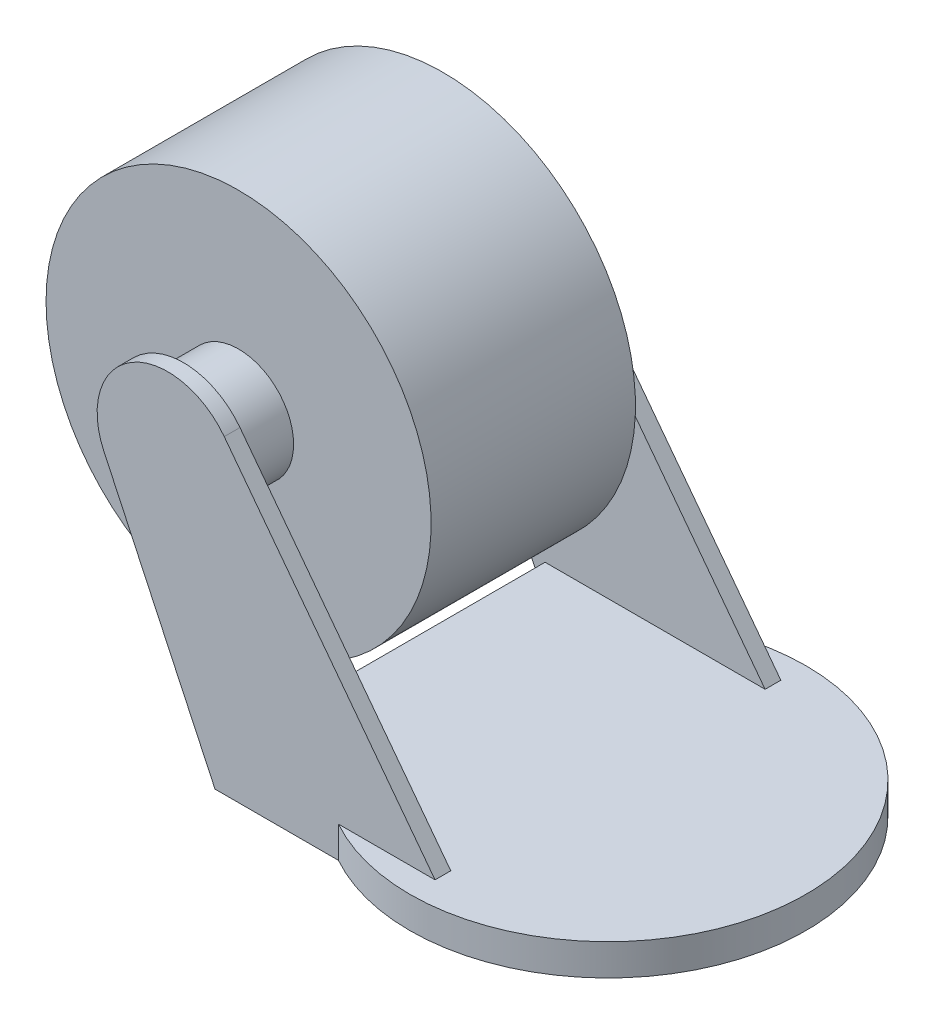
ISO-10303-21;
HEADER;
FILE_DESCRIPTION(('STEP AP214'),'2;1');
FILE_NAME('part.step','',(''),(''),'','','');
FILE_SCHEMA(('AUTOMOTIVE_DESIGN { 1 0 10303 214 1 1 1 1 }'));
ENDSEC;
DATA;
#1=APPLICATION_CONTEXT('core data for automotive mechanical design processes');
#2=APPLICATION_PROTOCOL_DEFINITION('international standard','automotive_design',2000,#1);
#3=PRODUCT_CONTEXT('',#1,'mechanical');
#4=PRODUCT('Part','Part','',(#3));
#5=PRODUCT_RELATED_PRODUCT_CATEGORY('part','',(#4));
#6=PRODUCT_DEFINITION_FORMATION('','',#4);
#7=PRODUCT_DEFINITION_CONTEXT('part definition',#1,'design');
#8=PRODUCT_DEFINITION('design','',#6,#7);
#9=PRODUCT_DEFINITION_SHAPE('','',#8);
#10=(LENGTH_UNIT() NAMED_UNIT(*) SI_UNIT(.MILLI.,.METRE.));
#11=(NAMED_UNIT(*) PLANE_ANGLE_UNIT() SI_UNIT($,.RADIAN.));
#12=(NAMED_UNIT(*) SI_UNIT($,.STERADIAN.) SOLID_ANGLE_UNIT());
#13=UNCERTAINTY_MEASURE_WITH_UNIT(LENGTH_MEASURE(1.E-05),#10,'distance_accuracy_value','');
#14=(GEOMETRIC_REPRESENTATION_CONTEXT(3) GLOBAL_UNCERTAINTY_ASSIGNED_CONTEXT((#13)) GLOBAL_UNIT_ASSIGNED_CONTEXT((#10,
#11,#12)) REPRESENTATION_CONTEXT('',''));
#15=CARTESIAN_POINT('',(0.,0.,0.));
#16=DIRECTION('',(0.,0.,1.));
#17=DIRECTION('',(1.,0.,0.));
#18=AXIS2_PLACEMENT_3D('',#15,#16,#17);
#19=CARTESIAN_POINT('',(-17.,17.,-9.89949493661167));
#20=DIRECTION('',(0.,0.,1.));
#21=DIRECTION('',(1.,0.,0.));
#22=AXIS2_PLACEMENT_3D('',#19,#20,#21);
#23=CYLINDRICAL_SURFACE('',#22,3.5);
#24=CARTESIAN_POINT('',(-17.,17.,-10.));
#25=DIRECTION('',(0.,0.,-1.));
#26=DIRECTION('',(-1.,0.,0.));
#27=AXIS2_PLACEMENT_3D('',#24,#25,#26);
#28=CIRCLE('',#27,3.5);
#29=CARTESIAN_POINT('',(-20.5,17.,-10.));
#30=VERTEX_POINT('',#29);
#31=EDGE_CURVE('E42',#30,#30,#28,.F.);
#32=ORIENTED_EDGE('',*,*,#31,.T.);
#33=EDGE_LOOP('',(#32));
#34=FACE_BOUND('',#33,.T.);
#35=CARTESIAN_POINT('',(-17.,17.,-6.5));
#36=DIRECTION('',(0.,0.,1.));
#37=DIRECTION('',(1.,0.,0.));
#38=AXIS2_PLACEMENT_3D('',#35,#36,#37);
#39=CIRCLE('',#38,3.5);
#40=CARTESIAN_POINT('',(-13.5,17.,-6.5));
#41=VERTEX_POINT('',#40);
#42=EDGE_CURVE('E154',#41,#41,#39,.F.);
#43=ORIENTED_EDGE('',*,*,#42,.T.);
#44=EDGE_LOOP('',(#43));
#45=FACE_BOUND('',#44,.T.);
#46=ADVANCED_FACE('F34',(#34,#45),#23,.T.);
#47=CARTESIAN_POINT('',(-17.,17.,-10.));
#48=DIRECTION('',(0.,0.,-1.));
#49=DIRECTION('',(1.,0.,0.));
#50=AXIS2_PLACEMENT_3D('',#47,#48,#49);
#51=PLANE('',#50);
#52=DIRECTION('',(0.424488254823815,-0.905433444001618,0.));
#53=VECTOR('',#52,1.);
#54=CARTESIAN_POINT('',(-14.,0.,-10.));
#55=LINE('',#54,#53);
#56=CARTESIAN_POINT('',(-21.0744504980073,15.0898028532928,-10.));
#57=VERTEX_POINT('',#56);
#58=CARTESIAN_POINT('',(-14.,0.,-10.));
#59=VERTEX_POINT('',#58);
#60=EDGE_CURVE('E126',#57,#59,#55,.T.);
#61=ORIENTED_EDGE('',*,*,#60,.T.);
#62=DIRECTION('',(0.,-1.,0.));
#63=VECTOR('',#62,1.);
#64=CARTESIAN_POINT('',(-14.,2.,-10.));
#65=LINE('',#64,#63);
#66=CARTESIAN_POINT('',(-14.,2.,-10.));
#67=VERTEX_POINT('',#66);
#68=EDGE_CURVE('E208',#67,#59,#65,.T.);
#69=ORIENTED_EDGE('',*,*,#68,.F.);
#70=DIRECTION('',(-1.,0.,0.));
#71=VECTOR('',#70,1.);
#72=CARTESIAN_POINT('',(-14.,2.,-10.));
#73=LINE('',#72,#71);
#74=CARTESIAN_POINT('',(0.,2.,-10.));
#75=VERTEX_POINT('',#74);
#76=EDGE_CURVE('E57',#75,#67,#73,.T.);
#77=ORIENTED_EDGE('',*,*,#76,.F.);
#78=DIRECTION('',(-0.603595841898663,0.797290448734114,0.));
#79=VECTOR('',#78,1.);
#80=CARTESIAN_POINT('',(0.,2.,-10.));
#81=LINE('',#80,#79);
#82=CARTESIAN_POINT('',(-13.4121929806965,19.716181288544,-10.));
#83=VERTEX_POINT('',#82);
#84=EDGE_CURVE('E142',#75,#83,#81,.T.);
#85=ORIENTED_EDGE('',*,*,#84,.T.);
#86=CARTESIAN_POINT('',(-17.,17.,-10.));
#87=DIRECTION('',(0.,0.,1.));
#88=DIRECTION('',(1.,0.,0.));
#89=AXIS2_PLACEMENT_3D('',#86,#87,#88);
#90=CIRCLE('',#89,4.5);
#91=EDGE_CURVE('E153',#83,#57,#90,.T.);
#92=ORIENTED_EDGE('',*,*,#91,.T.);
#93=EDGE_LOOP('',(#61,#69,#77,#85,#92));
#94=FACE_BOUND('',#93,.T.);
#95=ORIENTED_EDGE('',*,*,#31,.F.);
#96=EDGE_LOOP('',(#95));
#97=FACE_BOUND('',#96,.T.);
#98=ADVANCED_FACE('F245',(#94,#97),#51,.F.);
#99=CARTESIAN_POINT('',(-14.,2.,-10.));
#100=DIRECTION('',(1.,0.,0.));
#101=DIRECTION('',(0.,0.,-1.));
#102=AXIS2_PLACEMENT_3D('',#99,#100,#101);
#103=PLANE('',#102);
#104=DIRECTION('',(0.,0.,1.));
#105=VECTOR('',#104,1.);
#106=CARTESIAN_POINT('',(-14.,0.,-10.));
#107=LINE('',#106,#105);
#108=CARTESIAN_POINT('',(-14.,0.,10.));
#109=VERTEX_POINT('',#108);
#110=EDGE_CURVE('E199',#59,#109,#107,.T.);
#111=ORIENTED_EDGE('',*,*,#110,.T.);
#112=DIRECTION('',(0.,-1.,0.));
#113=VECTOR('',#112,1.);
#114=CARTESIAN_POINT('',(-14.,2.,10.));
#115=LINE('',#114,#113);
#116=CARTESIAN_POINT('',(-14.,2.,10.));
#117=VERTEX_POINT('',#116);
#118=EDGE_CURVE('E213',#117,#109,#115,.T.);
#119=ORIENTED_EDGE('',*,*,#118,.F.);
#120=DIRECTION('',(0.,0.,1.));
#121=VECTOR('',#120,1.);
#122=CARTESIAN_POINT('',(-14.,2.,-10.));
#123=LINE('',#122,#121);
#124=EDGE_CURVE('E200',#67,#117,#123,.T.);
#125=ORIENTED_EDGE('',*,*,#124,.F.);
#126=ORIENTED_EDGE('',*,*,#68,.T.);
#127=EDGE_LOOP('',(#111,#119,#125,#126));
#128=FACE_BOUND('',#127,.T.);
#129=ADVANCED_FACE('F36',(#128),#103,.F.);
#130=CARTESIAN_POINT('',(0.,2.,0.));
#131=DIRECTION('',(0.,-1.,0.));
#132=DIRECTION('',(0.,0.,-1.));
#133=AXIS2_PLACEMENT_3D('',#130,#131,#132);
#134=CYLINDRICAL_SURFACE('',#133,12.6);
#135=CARTESIAN_POINT('',(0.,0.,0.));
#136=DIRECTION('',(0.,1.,0.));
#137=DIRECTION('',(0.,0.,1.));
#138=AXIS2_PLACEMENT_3D('',#135,#136,#137);
#139=CIRCLE('',#138,12.6);
#140=CARTESIAN_POINT('',(-6.14491659829489,0.,11.));
#141=VERTEX_POINT('',#140);
#142=CARTESIAN_POINT('',(-6.14491659829489,0.,-11.));
#143=VERTEX_POINT('',#142);
#144=EDGE_CURVE('E203',#141,#143,#139,.T.);
#145=ORIENTED_EDGE('',*,*,#144,.T.);
#146=DIRECTION('',(0.,-1.,0.));
#147=VECTOR('',#146,1.);
#148=CARTESIAN_POINT('',(-6.14491659829489,2.,-11.));
#149=LINE('',#148,#147);
#150=CARTESIAN_POINT('',(-6.14491659829489,2.,-11.));
#151=VERTEX_POINT('',#150);
#152=EDGE_CURVE('E162',#143,#151,#149,.F.);
#153=ORIENTED_EDGE('',*,*,#152,.T.);
#154=CARTESIAN_POINT('',(0.,2.,0.));
#155=DIRECTION('',(0.,1.,0.));
#156=DIRECTION('',(0.,0.,1.));
#157=AXIS2_PLACEMENT_3D('',#154,#155,#156);
#158=CIRCLE('',#157,12.6);
#159=CARTESIAN_POINT('',(-6.14491659829489,2.,11.));
#160=VERTEX_POINT('',#159);
#161=EDGE_CURVE('E205',#160,#151,#158,.T.);
#162=ORIENTED_EDGE('',*,*,#161,.F.);
#163=DIRECTION('',(0.,-1.,0.));
#164=VECTOR('',#163,1.);
#165=CARTESIAN_POINT('',(-6.14491659829489,2.,11.));
#166=LINE('',#165,#164);
#167=EDGE_CURVE('E197',#160,#141,#166,.T.);
#168=ORIENTED_EDGE('',*,*,#167,.T.);
#169=EDGE_LOOP('',(#145,#153,#162,#168));
#170=FACE_BOUND('',#169,.T.);
#171=ADVANCED_FACE('F292',(#170),#134,.T.);
#172=CARTESIAN_POINT('',(0.,2.,0.));
#173=DIRECTION('',(0.,1.,0.));
#174=DIRECTION('',(0.,0.,1.));
#175=AXIS2_PLACEMENT_3D('',#172,#173,#174);
#176=PLANE('',#175);
#177=DIRECTION('',(-1.,0.,0.));
#178=VECTOR('',#177,1.);
#179=CARTESIAN_POINT('',(0.,2.,-11.));
#180=LINE('',#179,#178);
#181=CARTESIAN_POINT('',(0.,2.,-11.));
#182=VERTEX_POINT('',#181);
#183=EDGE_CURVE('E49',#182,#151,#180,.T.);
#184=ORIENTED_EDGE('',*,*,#183,.F.);
#185=DIRECTION('',(0.,0.,1.));
#186=VECTOR('',#185,1.);
#187=CARTESIAN_POINT('',(0.,2.,-11.));
#188=LINE('',#187,#186);
#189=EDGE_CURVE('E158',#182,#75,#188,.T.);
#190=ORIENTED_EDGE('',*,*,#189,.T.);
#191=ORIENTED_EDGE('',*,*,#76,.T.);
#192=ORIENTED_EDGE('',*,*,#124,.T.);
#193=DIRECTION('',(1.,0.,0.));
#194=VECTOR('',#193,1.);
#195=CARTESIAN_POINT('',(-14.,2.,10.));
#196=LINE('',#195,#194);
#197=CARTESIAN_POINT('',(0.,2.,10.));
#198=VERTEX_POINT('',#197);
#199=EDGE_CURVE('E202',#117,#198,#196,.T.);
#200=ORIENTED_EDGE('',*,*,#199,.T.);
#201=DIRECTION('',(0.,0.,-1.));
#202=VECTOR('',#201,1.);
#203=CARTESIAN_POINT('',(0.,2.,11.));
#204=LINE('',#203,#202);
#205=CARTESIAN_POINT('',(0.,2.,11.));
#206=VERTEX_POINT('',#205);
#207=EDGE_CURVE('E188',#206,#198,#204,.T.);
#208=ORIENTED_EDGE('',*,*,#207,.F.);
#209=DIRECTION('',(1.,0.,0.));
#210=VECTOR('',#209,1.);
#211=CARTESIAN_POINT('',(0.,2.,11.));
#212=LINE('',#211,#210);
#213=EDGE_CURVE('E194',#160,#206,#212,.T.);
#214=ORIENTED_EDGE('',*,*,#213,.F.);
#215=ORIENTED_EDGE('',*,*,#161,.T.);
#216=EDGE_LOOP('',(#184,#190,#191,#192,#200,#208,#214,#215));
#217=FACE_BOUND('',#216,.T.);
#218=ADVANCED_FACE('F281',(#217),#176,.T.);
#219=CARTESIAN_POINT('',(0.,0.,0.));
#220=DIRECTION('',(0.,1.,0.));
#221=DIRECTION('',(0.,0.,1.));
#222=AXIS2_PLACEMENT_3D('',#219,#220,#221);
#223=PLANE('',#222);
#224=DIRECTION('',(1.,0.,0.));
#225=VECTOR('',#224,1.);
#226=CARTESIAN_POINT('',(0.,0.,-11.));
#227=LINE('',#226,#225);
#228=CARTESIAN_POINT('',(-14.,0.,-11.));
#229=VERTEX_POINT('',#228);
#230=EDGE_CURVE('E141',#229,#143,#227,.T.);
#231=ORIENTED_EDGE('',*,*,#230,.T.);
#232=ORIENTED_EDGE('',*,*,#144,.F.);
#233=DIRECTION('',(1.,0.,0.));
#234=VECTOR('',#233,1.);
#235=CARTESIAN_POINT('',(0.,0.,11.));
#236=LINE('',#235,#234);
#237=CARTESIAN_POINT('',(-14.,0.,11.));
#238=VERTEX_POINT('',#237);
#239=EDGE_CURVE('E168',#238,#141,#236,.T.);
#240=ORIENTED_EDGE('',*,*,#239,.F.);
#241=DIRECTION('',(0.,0.,-1.));
#242=VECTOR('',#241,1.);
#243=CARTESIAN_POINT('',(-14.,0.,11.));
#244=LINE('',#243,#242);
#245=EDGE_CURVE('E191',#238,#109,#244,.T.);
#246=ORIENTED_EDGE('',*,*,#245,.T.);
#247=ORIENTED_EDGE('',*,*,#110,.F.);
#248=DIRECTION('',(0.,0.,1.));
#249=VECTOR('',#248,1.);
#250=CARTESIAN_POINT('',(-14.,0.,-11.));
#251=LINE('',#250,#249);
#252=EDGE_CURVE('E151',#229,#59,#251,.T.);
#253=ORIENTED_EDGE('',*,*,#252,.F.);
#254=EDGE_LOOP('',(#231,#232,#240,#246,#247,#253));
#255=FACE_BOUND('',#254,.T.);
#256=ADVANCED_FACE('F295',(#255),#223,.F.);
#257=CARTESIAN_POINT('',(-17.,17.,11.));
#258=DIRECTION('',(0.,0.,1.));
#259=DIRECTION('',(1.,0.,0.));
#260=AXIS2_PLACEMENT_3D('',#257,#258,#259);
#261=PLANE('',#260);
#262=ORIENTED_EDGE('',*,*,#167,.F.);
#263=ORIENTED_EDGE('',*,*,#213,.T.);
#264=DIRECTION('',(-0.603595841898663,0.797290448734114,0.));
#265=VECTOR('',#264,1.);
#266=CARTESIAN_POINT('',(0.,2.,11.));
#267=LINE('',#266,#265);
#268=CARTESIAN_POINT('',(-13.4121929806965,19.716181288544,11.));
#269=VERTEX_POINT('',#268);
#270=EDGE_CURVE('E172',#206,#269,#267,.T.);
#271=ORIENTED_EDGE('',*,*,#270,.T.);
#272=CARTESIAN_POINT('',(-17.,17.,11.));
#273=DIRECTION('',(0.,0.,1.));
#274=DIRECTION('',(1.,0.,0.));
#275=AXIS2_PLACEMENT_3D('',#272,#273,#274);
#276=CIRCLE('',#275,4.5);
#277=CARTESIAN_POINT('',(-21.0744504980073,15.0898028532928,11.));
#278=VERTEX_POINT('',#277);
#279=EDGE_CURVE('E174',#269,#278,#276,.T.);
#280=ORIENTED_EDGE('',*,*,#279,.T.);
#281=DIRECTION('',(0.424488254823815,-0.905433444001618,0.));
#282=VECTOR('',#281,1.);
#283=CARTESIAN_POINT('',(-14.,0.,11.));
#284=LINE('',#283,#282);
#285=EDGE_CURVE('E165',#278,#238,#284,.T.);
#286=ORIENTED_EDGE('',*,*,#285,.T.);
#287=ORIENTED_EDGE('',*,*,#239,.T.);
#288=EDGE_LOOP('',(#262,#263,#271,#280,#286,#287));
#289=FACE_BOUND('',#288,.T.);
#290=ADVANCED_FACE('F274',(#289),#261,.T.);
#291=CARTESIAN_POINT('',(-17.,17.,10.));
#292=DIRECTION('',(0.,0.,1.));
#293=DIRECTION('',(1.,0.,0.));
#294=AXIS2_PLACEMENT_3D('',#291,#292,#293);
#295=PLANE('',#294);
#296=CARTESIAN_POINT('',(-17.,17.,10.));
#297=DIRECTION('',(0.,0.,1.));
#298=DIRECTION('',(1.,0.,0.));
#299=AXIS2_PLACEMENT_3D('',#296,#297,#298);
#300=CIRCLE('',#299,3.5);
#301=CARTESIAN_POINT('',(-13.5,17.,10.));
#302=VERTEX_POINT('',#301);
#303=EDGE_CURVE('E164',#302,#302,#300,.T.);
#304=ORIENTED_EDGE('',*,*,#303,.T.);
#305=EDGE_LOOP('',(#304));
#306=FACE_BOUND('',#305,.T.);
#307=ORIENTED_EDGE('',*,*,#199,.F.);
#308=ORIENTED_EDGE('',*,*,#118,.T.);
#309=DIRECTION('',(0.424488254823815,-0.905433444001618,0.));
#310=VECTOR('',#309,1.);
#311=CARTESIAN_POINT('',(-14.,0.,10.));
#312=LINE('',#311,#310);
#313=CARTESIAN_POINT('',(-21.0744504980073,15.0898028532928,10.));
#314=VERTEX_POINT('',#313);
#315=EDGE_CURVE('E177',#314,#109,#312,.T.);
#316=ORIENTED_EDGE('',*,*,#315,.F.);
#317=CARTESIAN_POINT('',(-17.,17.,10.));
#318=DIRECTION('',(0.,0.,1.));
#319=DIRECTION('',(1.,0.,0.));
#320=AXIS2_PLACEMENT_3D('',#317,#318,#319);
#321=CIRCLE('',#320,4.5);
#322=CARTESIAN_POINT('',(-13.4121929806965,19.716181288544,10.));
#323=VERTEX_POINT('',#322);
#324=EDGE_CURVE('E169',#323,#314,#321,.T.);
#325=ORIENTED_EDGE('',*,*,#324,.F.);
#326=DIRECTION('',(-0.603595841898663,0.797290448734114,0.));
#327=VECTOR('',#326,1.);
#328=CARTESIAN_POINT('',(0.,2.,10.));
#329=LINE('',#328,#327);
#330=EDGE_CURVE('E180',#198,#323,#329,.T.);
#331=ORIENTED_EDGE('',*,*,#330,.F.);
#332=EDGE_LOOP('',(#307,#308,#316,#325,#331));
#333=FACE_BOUND('',#332,.T.);
#334=ADVANCED_FACE('F270',(#306,#333),#295,.F.);
#335=CARTESIAN_POINT('',(-14.,0.,11.));
#336=DIRECTION('',(0.905433444001618,0.424488254823815,0.));
#337=DIRECTION('',(-0.424488254823815,0.905433444001618,0.));
#338=AXIS2_PLACEMENT_3D('',#335,#336,#337);
#339=PLANE('',#338);
#340=ORIENTED_EDGE('',*,*,#315,.T.);
#341=ORIENTED_EDGE('',*,*,#245,.F.);
#342=ORIENTED_EDGE('',*,*,#285,.F.);
#343=DIRECTION('',(0.,0.,-1.));
#344=VECTOR('',#343,1.);
#345=CARTESIAN_POINT('',(-21.0744504980073,15.0898028532928,11.));
#346=LINE('',#345,#344);
#347=EDGE_CURVE('E176',#278,#314,#346,.T.);
#348=ORIENTED_EDGE('',*,*,#347,.T.);
#349=EDGE_LOOP('',(#340,#341,#342,#348));
#350=FACE_BOUND('',#349,.T.);
#351=ADVANCED_FACE('F273',(#350),#339,.F.);
#352=CARTESIAN_POINT('',(0.,2.,11.));
#353=DIRECTION('',(-0.797290448734114,-0.603595841898663,0.));
#354=DIRECTION('',(0.603595841898663,-0.797290448734114,0.));
#355=AXIS2_PLACEMENT_3D('',#352,#353,#354);
#356=PLANE('',#355);
#357=ORIENTED_EDGE('',*,*,#330,.T.);
#358=DIRECTION('',(0.,0.,-1.));
#359=VECTOR('',#358,1.);
#360=CARTESIAN_POINT('',(-13.4121929806965,19.716181288544,11.));
#361=LINE('',#360,#359);
#362=EDGE_CURVE('E185',#269,#323,#361,.T.);
#363=ORIENTED_EDGE('',*,*,#362,.F.);
#364=ORIENTED_EDGE('',*,*,#270,.F.);
#365=ORIENTED_EDGE('',*,*,#207,.T.);
#366=EDGE_LOOP('',(#357,#363,#364,#365));
#367=FACE_BOUND('',#366,.T.);
#368=ADVANCED_FACE('F263',(#367),#356,.F.);
#369=CARTESIAN_POINT('',(-17.,17.,11.));
#370=DIRECTION('',(0.,0.,-1.));
#371=DIRECTION('',(-1.,0.,0.));
#372=AXIS2_PLACEMENT_3D('',#369,#370,#371);
#373=CYLINDRICAL_SURFACE('',#372,4.5);
#374=ORIENTED_EDGE('',*,*,#324,.T.);
#375=ORIENTED_EDGE('',*,*,#347,.F.);
#376=ORIENTED_EDGE('',*,*,#279,.F.);
#377=ORIENTED_EDGE('',*,*,#362,.T.);
#378=EDGE_LOOP('',(#374,#375,#376,#377));
#379=FACE_BOUND('',#378,.T.);
#380=ADVANCED_FACE('F256',(#379),#373,.T.);
#381=CARTESIAN_POINT('',(-17.,17.,6.5));
#382=DIRECTION('',(0.,0.,1.));
#383=DIRECTION('',(1.,0.,0.));
#384=AXIS2_PLACEMENT_3D('',#381,#382,#383);
#385=CIRCLE('',#384,3.5);
#386=CARTESIAN_POINT('',(-13.5,17.,6.5));
#387=VERTEX_POINT('',#386);
#388=EDGE_CURVE('E11',#387,#387,#385,.F.);
#389=ORIENTED_EDGE('',*,*,#388,.F.);
#390=EDGE_LOOP('',(#389));
#391=FACE_BOUND('',#390,.T.);
#392=ORIENTED_EDGE('',*,*,#303,.F.);
#393=EDGE_LOOP('',(#392));
#394=FACE_BOUND('',#393,.T.);
#395=ADVANCED_FACE('F248',(#391,#394),#23,.T.);
#396=CARTESIAN_POINT('',(-17.,17.,-11.));
#397=DIRECTION('',(0.,0.,-1.));
#398=DIRECTION('',(1.,0.,0.));
#399=AXIS2_PLACEMENT_3D('',#396,#397,#398);
#400=PLANE('',#399);
#401=ORIENTED_EDGE('',*,*,#152,.F.);
#402=ORIENTED_EDGE('',*,*,#230,.F.);
#403=DIRECTION('',(0.424488254823815,-0.905433444001618,0.));
#404=VECTOR('',#403,1.);
#405=CARTESIAN_POINT('',(-14.,0.,-11.));
#406=LINE('',#405,#404);
#407=CARTESIAN_POINT('',(-21.0744504980073,15.0898028532928,-11.));
#408=VERTEX_POINT('',#407);
#409=EDGE_CURVE('E123',#408,#229,#406,.T.);
#410=ORIENTED_EDGE('',*,*,#409,.F.);
#411=CARTESIAN_POINT('',(-17.,17.,-11.));
#412=DIRECTION('',(0.,0.,1.));
#413=DIRECTION('',(1.,0.,0.));
#414=AXIS2_PLACEMENT_3D('',#411,#412,#413);
#415=CIRCLE('',#414,4.5);
#416=CARTESIAN_POINT('',(-13.4121929806965,19.716181288544,-11.));
#417=VERTEX_POINT('',#416);
#418=EDGE_CURVE('E138',#417,#408,#415,.T.);
#419=ORIENTED_EDGE('',*,*,#418,.F.);
#420=DIRECTION('',(-0.603595841898663,0.797290448734114,0.));
#421=VECTOR('',#420,1.);
#422=CARTESIAN_POINT('',(0.,2.,-11.));
#423=LINE('',#422,#421);
#424=EDGE_CURVE('E145',#182,#417,#423,.T.);
#425=ORIENTED_EDGE('',*,*,#424,.F.);
#426=ORIENTED_EDGE('',*,*,#183,.T.);
#427=EDGE_LOOP('',(#401,#402,#410,#419,#425,#426));
#428=FACE_BOUND('',#427,.T.);
#429=ADVANCED_FACE('F136',(#428),#400,.T.);
#430=CARTESIAN_POINT('',(-14.,0.,-11.));
#431=DIRECTION('',(-0.905433444001618,-0.424488254823815,0.));
#432=DIRECTION('',(0.424488254823815,-0.905433444001618,0.));
#433=AXIS2_PLACEMENT_3D('',#430,#431,#432);
#434=PLANE('',#433);
#435=ORIENTED_EDGE('',*,*,#60,.F.);
#436=DIRECTION('',(0.,0.,1.));
#437=VECTOR('',#436,1.);
#438=CARTESIAN_POINT('',(-21.0744504980073,15.0898028532928,-11.));
#439=LINE('',#438,#437);
#440=EDGE_CURVE('E119',#408,#57,#439,.T.);
#441=ORIENTED_EDGE('',*,*,#440,.F.);
#442=ORIENTED_EDGE('',*,*,#409,.T.);
#443=ORIENTED_EDGE('',*,*,#252,.T.);
#444=EDGE_LOOP('',(#435,#441,#442,#443));
#445=FACE_BOUND('',#444,.T.);
#446=ADVANCED_FACE('F121',(#445),#434,.T.);
#447=CARTESIAN_POINT('',(-17.,17.,-11.));
#448=DIRECTION('',(0.,0.,1.));
#449=DIRECTION('',(1.,0.,0.));
#450=AXIS2_PLACEMENT_3D('',#447,#448,#449);
#451=CYLINDRICAL_SURFACE('',#450,4.5);
#452=ORIENTED_EDGE('',*,*,#91,.F.);
#453=DIRECTION('',(0.,0.,1.));
#454=VECTOR('',#453,1.);
#455=CARTESIAN_POINT('',(-13.4121929806965,19.716181288544,-11.));
#456=LINE('',#455,#454);
#457=EDGE_CURVE('E131',#417,#83,#456,.T.);
#458=ORIENTED_EDGE('',*,*,#457,.F.);
#459=ORIENTED_EDGE('',*,*,#418,.T.);
#460=ORIENTED_EDGE('',*,*,#440,.T.);
#461=EDGE_LOOP('',(#452,#458,#459,#460));
#462=FACE_BOUND('',#461,.T.);
#463=ADVANCED_FACE('F144',(#462),#451,.T.);
#464=CARTESIAN_POINT('',(0.,2.,-11.));
#465=DIRECTION('',(0.797290448734114,0.603595841898663,0.));
#466=DIRECTION('',(-0.603595841898663,0.797290448734114,0.));
#467=AXIS2_PLACEMENT_3D('',#464,#465,#466);
#468=PLANE('',#467);
#469=ORIENTED_EDGE('',*,*,#84,.F.);
#470=ORIENTED_EDGE('',*,*,#189,.F.);
#471=ORIENTED_EDGE('',*,*,#424,.T.);
#472=ORIENTED_EDGE('',*,*,#457,.T.);
#473=EDGE_LOOP('',(#469,#470,#471,#472));
#474=FACE_BOUND('',#473,.T.);
#475=ADVANCED_FACE('F299',(#474),#468,.T.);
#476=CARTESIAN_POINT('',(-17.,17.,6.5));
#477=DIRECTION('',(0.,0.,-1.));
#478=DIRECTION('',(-1.,0.,0.));
#479=AXIS2_PLACEMENT_3D('',#476,#477,#478);
#480=CYLINDRICAL_SURFACE('',#479,12.25);
#481=CARTESIAN_POINT('',(-17.,17.,6.5));
#482=DIRECTION('',(0.,0.,1.));
#483=DIRECTION('',(1.,0.,0.));
#484=AXIS2_PLACEMENT_3D('',#481,#482,#483);
#485=CIRCLE('',#484,12.25);
#486=CARTESIAN_POINT('',(-29.25,17.,6.5));
#487=VERTEX_POINT('',#486);
#488=EDGE_CURVE('E220',#487,#487,#485,.T.);
#489=CARTESIAN_POINT('',(-17.,17.,-6.5));
#490=DIRECTION('',(0.,0.,1.));
#491=DIRECTION('',(1.,0.,0.));
#492=AXIS2_PLACEMENT_3D('',#489,#490,#491);
#493=CIRCLE('',#492,12.25);
#494=CARTESIAN_POINT('',(-29.25,17.,-6.5));
#495=VERTEX_POINT('',#494);
#496=EDGE_CURVE('E224',#495,#495,#493,.T.);
#497=CARTESIAN_POINT('',(-29.25,17.,6.5));
#498=CARTESIAN_POINT('',(-29.25,17.,6.36458333333333));
#499=CARTESIAN_POINT('',(-29.25,17.,6.22916666666667));
#500=CARTESIAN_POINT('',(-29.25,17.,5.95833333333333));
#501=CARTESIAN_POINT('',(-29.25,17.,5.82291666666667));
#502=CARTESIAN_POINT('',(-29.25,17.,5.55208333333333));
#503=CARTESIAN_POINT('',(-29.25,17.,5.41666666666667));
#504=CARTESIAN_POINT('',(-29.25,17.,5.14583333333333));
#505=CARTESIAN_POINT('',(-29.25,17.,5.01041666666667));
#506=CARTESIAN_POINT('',(-29.25,17.,4.73958333333333));
#507=CARTESIAN_POINT('',(-29.25,17.,4.60416666666667));
#508=CARTESIAN_POINT('',(-29.25,17.,4.33333333333333));
#509=CARTESIAN_POINT('',(-29.25,17.,4.19791666666667));
#510=CARTESIAN_POINT('',(-29.25,17.,3.92708333333333));
#511=CARTESIAN_POINT('',(-29.25,17.,3.79166666666667));
#512=CARTESIAN_POINT('',(-29.25,17.,3.52083333333333));
#513=CARTESIAN_POINT('',(-29.25,17.,3.38541666666667));
#514=CARTESIAN_POINT('',(-29.25,17.,3.11458333333333));
#515=CARTESIAN_POINT('',(-29.25,17.,2.97916666666667));
#516=CARTESIAN_POINT('',(-29.25,17.,2.70833333333333));
#517=CARTESIAN_POINT('',(-29.25,17.,2.57291666666667));
#518=CARTESIAN_POINT('',(-29.25,17.,2.30208333333333));
#519=CARTESIAN_POINT('',(-29.25,17.,2.16666666666667));
#520=CARTESIAN_POINT('',(-29.25,17.,1.89583333333333));
#521=CARTESIAN_POINT('',(-29.25,17.,1.76041666666667));
#522=CARTESIAN_POINT('',(-29.25,17.,1.48958333333333));
#523=CARTESIAN_POINT('',(-29.25,17.,1.35416666666667));
#524=CARTESIAN_POINT('',(-29.25,17.,1.08333333333333));
#525=CARTESIAN_POINT('',(-29.25,17.,0.947916666666667));
#526=CARTESIAN_POINT('',(-29.25,17.,0.677083333333333));
#527=CARTESIAN_POINT('',(-29.25,17.,0.541666666666667));
#528=CARTESIAN_POINT('',(-29.25,17.,0.270833333333334));
#529=CARTESIAN_POINT('',(-29.25,17.,0.135416666666667));
#530=CARTESIAN_POINT('',(-29.25,17.,-0.135416666666667));
#531=CARTESIAN_POINT('',(-29.25,17.,-0.270833333333334));
#532=CARTESIAN_POINT('',(-29.25,17.,-0.541666666666667));
#533=CARTESIAN_POINT('',(-29.25,17.,-0.677083333333333));
#534=CARTESIAN_POINT('',(-29.25,17.,-0.947916666666667));
#535=CARTESIAN_POINT('',(-29.25,17.,-1.08333333333333));
#536=CARTESIAN_POINT('',(-29.25,17.,-1.35416666666667));
#537=CARTESIAN_POINT('',(-29.25,17.,-1.48958333333333));
#538=CARTESIAN_POINT('',(-29.25,17.,-1.76041666666667));
#539=CARTESIAN_POINT('',(-29.25,17.,-1.89583333333333));
#540=CARTESIAN_POINT('',(-29.25,17.,-2.16666666666667));
#541=CARTESIAN_POINT('',(-29.25,17.,-2.30208333333333));
#542=CARTESIAN_POINT('',(-29.25,17.,-2.57291666666667));
#543=CARTESIAN_POINT('',(-29.25,17.,-2.70833333333333));
#544=CARTESIAN_POINT('',(-29.25,17.,-2.97916666666667));
#545=CARTESIAN_POINT('',(-29.25,17.,-3.11458333333333));
#546=CARTESIAN_POINT('',(-29.25,17.,-3.38541666666667));
#547=CARTESIAN_POINT('',(-29.25,17.,-3.52083333333333));
#548=CARTESIAN_POINT('',(-29.25,17.,-3.79166666666667));
#549=CARTESIAN_POINT('',(-29.25,17.,-3.92708333333333));
#550=CARTESIAN_POINT('',(-29.25,17.,-4.19791666666667));
#551=CARTESIAN_POINT('',(-29.25,17.,-4.33333333333333));
#552=CARTESIAN_POINT('',(-29.25,17.,-4.60416666666667));
#553=CARTESIAN_POINT('',(-29.25,17.,-4.73958333333333));
#554=CARTESIAN_POINT('',(-29.25,17.,-5.01041666666667));
#555=CARTESIAN_POINT('',(-29.25,17.,-5.14583333333333));
#556=CARTESIAN_POINT('',(-29.25,17.,-5.41666666666667));
#557=CARTESIAN_POINT('',(-29.25,17.,-5.55208333333333));
#558=CARTESIAN_POINT('',(-29.25,17.,-5.82291666666667));
#559=CARTESIAN_POINT('',(-29.25,17.,-5.95833333333333));
#560=CARTESIAN_POINT('',(-29.25,17.,-6.22916666666667));
#561=CARTESIAN_POINT('',(-29.25,17.,-6.36458333333333));
#562=CARTESIAN_POINT('',(-29.25,17.,-6.5));
#563=B_SPLINE_CURVE_WITH_KNOTS('',3,(#497,#498,#499,#500,#501,#502,#503,#504,#505,#506,#507,
#508,#509,#510,#511,#512,#513,#514,#515,#516,#517,#518,#519,#520,#521,#522,#523,#524,#525,#526,
#527,#528,#529,#530,#531,#532,#533,#534,#535,#536,#537,#538,#539,#540,#541,#542,#543,#544,#545,
#546,#547,#548,#549,#550,#551,#552,#553,#554,#555,#556,#557,#558,#559,#560,#561,#562),
.UNSPECIFIED.,.F.,.F.,(4,2,2,2,2,2,2,2,2,2,2,2,2,2,2,2,2,2,2,2,2,2,2,2,2,2,2,2,2,2,2,2,4),(0.,
0.40625,0.812500000000001,1.21875,1.625,2.03125,2.4375,2.84375,3.25,3.65625,4.0625,4.46875,
4.875,5.28125,5.6875,6.09375,6.5,6.90625,7.3125,7.71875,8.125,8.53125,8.9375,9.34375,9.75,
10.15625,10.5625,10.96875,11.375,11.78125,12.1875,12.59375,13.),.UNSPECIFIED.);
#564=EDGE_CURVE('BSEAM231',#487,#495,#563,.T.);
#565=ORIENTED_EDGE('',*,*,#488,.F.);
#566=ORIENTED_EDGE('',*,*,#496,.T.);
#567=ORIENTED_EDGE('',*,*,#564,.T.);
#568=ORIENTED_EDGE('',*,*,#564,.F.);
#569=EDGE_LOOP('',(#565,#567,#566,#568));
#570=FACE_BOUND('',#569,.T.);
#571=ADVANCED_FACE('F231',(#570),#480,.T.);
#572=CARTESIAN_POINT('',(-17.,17.,6.5));
#573=DIRECTION('',(0.,0.,1.));
#574=DIRECTION('',(1.,0.,0.));
#575=AXIS2_PLACEMENT_3D('',#572,#573,#574);
#576=PLANE('',#575);
#577=ORIENTED_EDGE('',*,*,#388,.T.);
#578=EDGE_LOOP('',(#577));
#579=FACE_BOUND('',#578,.T.);
#580=ORIENTED_EDGE('',*,*,#488,.T.);
#581=EDGE_LOOP('',(#580));
#582=FACE_BOUND('',#581,.T.);
#583=ADVANCED_FACE('F235',(#579,#582),#576,.T.);
#584=CARTESIAN_POINT('',(-17.,17.,-6.5));
#585=DIRECTION('',(0.,0.,1.));
#586=DIRECTION('',(1.,0.,0.));
#587=AXIS2_PLACEMENT_3D('',#584,#585,#586);
#588=PLANE('',#587);
#589=ORIENTED_EDGE('',*,*,#42,.F.);
#590=EDGE_LOOP('',(#589));
#591=FACE_BOUND('',#590,.T.);
#592=ORIENTED_EDGE('',*,*,#496,.F.);
#593=EDGE_LOOP('',(#592));
#594=FACE_BOUND('',#593,.T.);
#595=ADVANCED_FACE('F233',(#591,#594),#588,.F.);
#596=CLOSED_SHELL('',(#46,#98,#129,#171,#218,#256,#290,#334,#351,#368,#380,#395,#429,#446,#463,
#475,#571,#583,#595));
#597=MANIFOLD_SOLID_BREP('B2',#596);
#598=ADVANCED_BREP_SHAPE_REPRESENTATION('',(#18,#597),#14);
#599=SHAPE_DEFINITION_REPRESENTATION(#9,#598);
ENDSEC;
END-ISO-10303-21;
